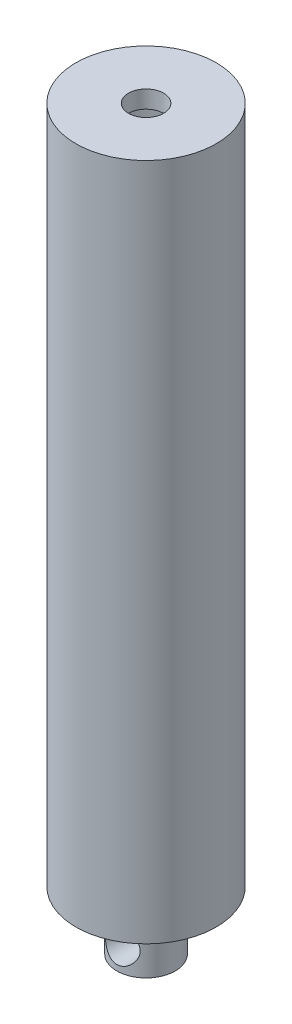
ISO-10303-21;
HEADER;
FILE_DESCRIPTION(('STEP AP214'),'2;1');
FILE_NAME('part.step','',(''),(''),'','','');
FILE_SCHEMA(('AUTOMOTIVE_DESIGN { 1 0 10303 214 1 1 1 1 }'));
ENDSEC;
DATA;
#1=APPLICATION_CONTEXT('core data for automotive mechanical design processes');
#2=APPLICATION_PROTOCOL_DEFINITION('international standard','automotive_design',2000,#1);
#3=PRODUCT_CONTEXT('',#1,'mechanical');
#4=PRODUCT('Part','Part','',(#3));
#5=PRODUCT_RELATED_PRODUCT_CATEGORY('part','',(#4));
#6=PRODUCT_DEFINITION_FORMATION('','',#4);
#7=PRODUCT_DEFINITION_CONTEXT('part definition',#1,'design');
#8=PRODUCT_DEFINITION('design','',#6,#7);
#9=PRODUCT_DEFINITION_SHAPE('','',#8);
#10=(LENGTH_UNIT() NAMED_UNIT(*) SI_UNIT(.MILLI.,.METRE.));
#11=(NAMED_UNIT(*) PLANE_ANGLE_UNIT() SI_UNIT($,.RADIAN.));
#12=(NAMED_UNIT(*) SI_UNIT($,.STERADIAN.) SOLID_ANGLE_UNIT());
#13=UNCERTAINTY_MEASURE_WITH_UNIT(LENGTH_MEASURE(1.E-05),#10,'distance_accuracy_value','');
#14=(GEOMETRIC_REPRESENTATION_CONTEXT(3) GLOBAL_UNCERTAINTY_ASSIGNED_CONTEXT((#13)) GLOBAL_UNIT_ASSIGNED_CONTEXT((#10,
#11,#12)) REPRESENTATION_CONTEXT('',''));
#15=CARTESIAN_POINT('',(0.,0.,0.));
#16=DIRECTION('',(0.,0.,1.));
#17=DIRECTION('',(1.,0.,0.));
#18=AXIS2_PLACEMENT_3D('',#15,#16,#17);
#19=CARTESIAN_POINT('',(0.,0.,0.));
#20=DIRECTION('',(0.,1.,0.));
#21=DIRECTION('',(0.,0.,1.));
#22=AXIS2_PLACEMENT_3D('',#19,#20,#21);
#23=PLANE('',#22);
#24=CARTESIAN_POINT('',(0.,0.,0.));
#25=DIRECTION('',(0.,-1.,0.));
#26=DIRECTION('',(0.,0.,-1.));
#27=AXIS2_PLACEMENT_3D('',#24,#25,#26);
#28=CIRCLE('',#27,5.);
#29=CARTESIAN_POINT('',(0.,0.,-5.));
#30=VERTEX_POINT('',#29);
#31=EDGE_CURVE('E10',#30,#30,#28,.T.);
#32=ORIENTED_EDGE('',*,*,#31,.T.);
#33=EDGE_LOOP('',(#32));
#34=FACE_BOUND('',#33,.T.);
#35=ADVANCED_FACE('F31',(#34),#23,.F.);
#36=CARTESIAN_POINT('',(0.,0.,0.));
#37=DIRECTION('',(0.,-1.,0.));
#38=DIRECTION('',(0.,0.,-1.));
#39=AXIS2_PLACEMENT_3D('',#36,#37,#38);
#40=CYLINDRICAL_SURFACE('',#39,5.);
#41=CARTESIAN_POINT('',(0.,6.96325935626031,-5.));
#42=CARTESIAN_POINT('',(-0.0767697294351706,6.96325830001577,-4.99999907546385));
#43=CARTESIAN_POINT('',(-0.153562134518387,6.96030576269024,-4.99822567812271));
#44=CARTESIAN_POINT('',(-0.306548487758715,6.94854512328057,-4.99118362570631));
#45=CARTESIAN_POINT('',(-0.382742059346593,6.93973359507208,-4.98591292553957));
#46=CARTESIAN_POINT('',(-0.609808130024627,6.90461079679718,-4.96499345352549));
#47=CARTESIAN_POINT('',(-0.758981863291667,6.86961165382687,-4.94423772571335));
#48=CARTESIAN_POINT('',(-1.04754167363585,6.77848661275619,-4.89123238995897));
#49=CARTESIAN_POINT('',(-1.18697226741342,6.72246543424757,-4.8590397955111));
#50=CARTESIAN_POINT('',(-1.45405042800218,6.59153869566327,-4.7859070225578));
#51=CARTESIAN_POINT('',(-1.58170090938261,6.51663782390015,-4.74496901614699));
#52=CARTESIAN_POINT('',(-1.83260160381823,6.34370970114519,-4.65410731283371));
#53=CARTESIAN_POINT('',(-1.95476885986166,6.24435196509377,-4.60373587041895));
#54=CARTESIAN_POINT('',(-2.1817645874806,6.02832494906812,-4.50060875905921));
#55=CARTESIAN_POINT('',(-2.28657046750403,5.91163348204196,-4.4478500955754));
#56=CARTESIAN_POINT('',(-2.48890019509837,5.6474123350914,-4.33822134833335));
#57=CARTESIAN_POINT('',(-2.5839553962784,5.49785581413813,-4.28164035635797));
#58=CARTESIAN_POINT('',(-2.74722868670786,5.18156620993343,-4.17876602596121));
#59=CARTESIAN_POINT('',(-2.8154903315581,5.01486156422715,-4.13245604474886));
#60=CARTESIAN_POINT('',(-2.90881204577224,4.71006645460341,-4.06709259377223));
#61=CARTESIAN_POINT('',(-2.94032394587637,4.57478735789892,-4.04415766338645));
#62=CARTESIAN_POINT('',(-2.98432344587083,4.29965192573892,-4.01180616527621));
#63=CARTESIAN_POINT('',(-2.99683469884359,4.15980150295627,-4.00237279089368));
#64=CARTESIAN_POINT('',(-3.0021101681982,3.87923636361245,-3.99841845126251));
#65=CARTESIAN_POINT('',(-2.99483563630785,3.73852049034844,-4.00392674756739));
#66=CARTESIAN_POINT('',(-2.96092124146105,3.46070182114245,-4.02906522155629));
#67=CARTESIAN_POINT('',(-2.93426681225441,3.32360182331882,-4.04870602134773));
#68=CARTESIAN_POINT('',(-2.86347831933193,3.05819881400977,-4.09906376582929));
#69=CARTESIAN_POINT('',(-2.8195745342289,2.92980503326585,-4.12963433300037));
#70=CARTESIAN_POINT('',(-2.71590167467071,2.68186958962851,-4.19854092703026));
#71=CARTESIAN_POINT('',(-2.65612678414159,2.56233119243128,-4.2368797994146));
#72=CARTESIAN_POINT('',(-2.51035773820671,2.31329021860397,-4.32510698365562));
#73=CARTESIAN_POINT('',(-2.42160671901867,2.18569936389258,-4.3758426358075));
#74=CARTESIAN_POINT('',(-2.22582963207776,1.94591019904019,-4.4786102252415));
#75=CARTESIAN_POINT('',(-2.11878609335504,1.83372679085818,-4.53064336077654));
#76=CARTESIAN_POINT('',(-1.87159040921357,1.61201709681182,-4.63871766962914));
#77=CARTESIAN_POINT('',(-1.72890315178768,1.50503996502296,-4.69430681953073));
#78=CARTESIAN_POINT('',(-1.50061053630278,1.36399064353745,-4.77018325995047));
#79=CARTESIAN_POINT('',(-1.42209821815681,1.3201952207442,-4.79423315237467));
#80=CARTESIAN_POINT('',(-1.26074368673913,1.23954053264931,-4.83916496756429));
#81=CARTESIAN_POINT('',(-1.17790417501176,1.2026770042395,-4.86004883588963));
#82=CARTESIAN_POINT('',(-1.01376371174001,1.13844791340367,-4.8968267274493));
#83=CARTESIAN_POINT('',(-0.932690066663955,1.1106327958111,-4.91295100454953));
#84=CARTESIAN_POINT('',(-0.767879949732825,1.06192540041508,-4.94139126794745));
#85=CARTESIAN_POINT('',(-0.684144997174636,1.04102924781395,-4.95370938553284));
#86=CARTESIAN_POINT('',(-0.514744462654421,1.00648750153555,-4.97416370514887));
#87=CARTESIAN_POINT('',(-0.429080341969608,0.992836600431699,-4.98230296820872));
#88=CARTESIAN_POINT('',(-0.256621746592204,0.972993171870105,-4.99415996414414));
#89=CARTESIAN_POINT('',(-0.169827432617757,0.966799595408988,-4.99787831889699));
#90=CARTESIAN_POINT('',(0.0673242571106443,0.960266685976682,-5.00179157954795));
#91=CARTESIAN_POINT('',(0.218056842610662,0.96744781062971,-4.99746512571837));
#92=CARTESIAN_POINT('',(0.515686907628998,1.00410489798941,-4.97557955020067));
#93=CARTESIAN_POINT('',(0.662584464852967,1.03358040860217,-4.95802069684413));
#94=CARTESIAN_POINT('',(0.945142599254815,1.11234781544458,-4.91189447655688));
#95=CARTESIAN_POINT('',(1.08098954856944,1.16114048285232,-4.88360514429733));
#96=CARTESIAN_POINT('',(1.34253345184752,1.27661368046122,-4.81827798628348));
#97=CARTESIAN_POINT('',(1.46822839746276,1.34329773885438,-4.78123843515362));
#98=CARTESIAN_POINT('',(1.7200119213015,1.50037344723828,-4.69690981059277));
#99=CARTESIAN_POINT('',(1.84478813824221,1.59250705009779,-4.6489560240695));
#100=CARTESIAN_POINT('',(2.07805222548222,1.79404210751507,-4.54948534225871));
#101=CARTESIAN_POINT('',(2.18652085154156,1.90346365586302,-4.49796434043363));
#102=CARTESIAN_POINT('',(2.39863988264158,2.15308014775347,-4.38890846835682));
#103=CARTESIAN_POINT('',(2.49982037884172,2.29542713020335,-4.33146483230154));
#104=CARTESIAN_POINT('',(2.67690479207535,2.59769140238787,-4.22432364395571));
#105=CARTESIAN_POINT('',(2.75283533845462,2.75758994341157,-4.1746179606141));
#106=CARTESIAN_POINT('',(2.86285157351706,3.05574540137103,-4.09969818429266));
#107=CARTESIAN_POINT('',(2.90243250662613,3.19121998090235,-4.07151318633887));
#108=CARTESIAN_POINT('',(2.96227327821697,3.46832351249554,-4.02819211510624));
#109=CARTESIAN_POINT('',(2.98255990395067,3.60994364571183,-4.01303795327895));
#110=CARTESIAN_POINT('',(3.00268261034206,3.89601325065553,-3.99800893189922));
#111=CARTESIAN_POINT('',(3.00244179030845,4.04047133450861,-3.99819152744816));
#112=CARTESIAN_POINT('',(2.98132945103105,4.32704823060671,-4.01395435932838));
#113=CARTESIAN_POINT('',(2.96044671369591,4.46916572813512,-4.02954296823692));
#114=CARTESIAN_POINT('',(2.90080351212233,4.74023618025541,-4.07266369966216));
#115=CARTESIAN_POINT('',(2.86295284328648,4.86949350418467,-4.09958421715569));
#116=CARTESIAN_POINT('',(2.77126473512031,5.11993390591346,-4.16211005816609));
#117=CARTESIAN_POINT('',(2.7174212751772,5.2411139218733,-4.19771865147484));
#118=CARTESIAN_POINT('',(2.58578536859698,5.4918988957203,-4.28025972950371));
#119=CARTESIAN_POINT('',(2.50558518231556,5.61994086447508,-4.32809142579694));
#120=CARTESIAN_POINT('',(2.32751213746957,5.86202020156691,-4.42640286674054));
#121=CARTESIAN_POINT('',(2.22962472612067,5.97604590673986,-4.47688476749088));
#122=CARTESIAN_POINT('',(2.00020353552556,6.20595819958978,-4.5845123827036));
#123=CARTESIAN_POINT('',(1.86578571790514,6.31910923612192,-4.64140045738634));
#124=CARTESIAN_POINT('',(1.57689277813436,6.52146734230845,-4.74731429537958));
#125=CARTESIAN_POINT('',(1.42241049573676,6.61066582918002,-4.79633723789531));
#126=CARTESIAN_POINT('',(1.18102189661685,6.72238383045084,-4.85920558314903));
#127=CARTESIAN_POINT('',(1.10025014285135,6.7555953522248,-4.87817139185349));
#128=CARTESIAN_POINT('',(0.935442217988384,6.81503149440377,-4.91243413775203));
#129=CARTESIAN_POINT('',(0.851407984788098,6.84126019196124,-4.9277332153652));
#130=CARTESIAN_POINT('',(0.681001816074564,6.88626879833606,-4.95415527987996));
#131=CARTESIAN_POINT('',(0.594637500609291,6.90507043356361,-4.9652904423195));
#132=CARTESIAN_POINT('',(0.420183746020761,6.9350037115833,-4.98308318645254));
#133=CARTESIAN_POINT('',(0.332095806784395,6.94614174241362,-4.98974449723791));
#134=CARTESIAN_POINT('',(0.203123929661335,6.95665104006564,-4.99603728421477));
#135=CARTESIAN_POINT('',(0.162556281113486,6.95912778671431,-4.99752198179196));
#136=CARTESIAN_POINT('',(0.0813278781867664,6.96243225317425,-4.99950360169341));
#137=CARTESIAN_POINT('',(0.0406671206271712,6.96325991578324,-5.00000048975323));
#138=CARTESIAN_POINT('',(0.,6.96325935626031,-5.));
#139=B_SPLINE_CURVE_WITH_KNOTS('',3,(#41,#42,#43,#44,#45,#46,#47,#48,#49,#50,#51,#52,#53,#54,
#55,#56,#57,#58,#59,#60,#61,#62,#63,#64,#65,#66,#67,#68,#69,#70,#71,#72,#73,#74,#75,#76,#77,#78,
#79,#80,#81,#82,#83,#84,#85,#86,#87,#88,#89,#90,#91,#92,#93,#94,#95,#96,#97,#98,#99,#100,#101,
#102,#103,#104,#105,#106,#107,#108,#109,#110,#111,#112,#113,#114,#115,#116,#117,#118,#119,#120,
#121,#122,#123,#124,#125,#126,#127,#128,#129,#130,#131,#132,#133,#134,#135,#136,#137,#138),
.UNSPECIFIED.,.T.,.F.,(4,2,2,2,2,2,2,2,2,2,2,2,2,2,2,2,2,2,2,2,2,2,2,2,2,2,2,2,2,2,2,2,2,2,2,2,
2,2,2,2,2,2,2,2,2,2,2,2,4),(0.,0.230263300595003,0.4606613693334,0.922002149276126,
1.38107466343613,1.84003329022065,2.33408870888555,2.82878205293211,3.38413315803225,
3.93857770807794,4.35913349134877,4.77916531256766,5.20002031165062,5.62119195971355,
6.03692224610024,6.45280509043347,6.94139679873935,7.43045779030959,7.98767605192993,
8.26653157143431,8.54521503013734,8.80648473589063,9.06760787545943,9.32853946730961,
9.58943435026958,10.0398406663534,10.490237849174,10.9296843257003,11.3692175250854,
11.8543559282721,12.3400624135416,12.889063860465,13.437484464234,13.8674843581987,
14.2968863865712,14.7278971274535,15.1591422350194,15.5696105785277,15.9802336423656,
16.4539008129506,16.927959499309,17.4794148474152,18.0310675325446,18.2988384573895,
18.5664526907294,18.8332781687618,19.0998809626714,19.221853785686,19.3438308395353),.UNSPECIFIED.);
#140=CARTESIAN_POINT('',(0.,6.96325935626031,-5.));
#141=VERTEX_POINT('',#140);
#142=EDGE_CURVE('E34',#141,#141,#139,.T.);
#143=ORIENTED_EDGE('',*,*,#142,.T.);
#144=EDGE_LOOP('',(#143));
#145=FACE_BOUND('',#144,.T.);
#146=CARTESIAN_POINT('',(3.,3.96325935626031,4.));
#147=CARTESIAN_POINT('',(2.9999999059924,3.88779774589465,3.99999997094658));
#148=CARTESIAN_POINT('',(2.99714660074499,3.8123394044346,4.00214560778386));
#149=CARTESIAN_POINT('',(2.98579602023829,3.66207577710443,4.01061905841259));
#150=CARTESIAN_POINT('',(2.97729658251829,3.58727075257959,4.01694847458097));
#151=CARTESIAN_POINT('',(2.94350195877,3.36471695546019,4.04185988554313));
#152=CARTESIAN_POINT('',(2.90991036792577,3.21879319322166,4.06636523363867));
#153=CARTESIAN_POINT('',(2.82286888064331,2.93706406238728,4.12724466313279));
#154=CARTESIAN_POINT('',(2.76956233581239,2.80119394653875,4.16353284212727));
#155=CARTESIAN_POINT('',(2.64505893939301,2.54039218483435,4.24371857831163));
#156=CARTESIAN_POINT('',(2.57385675138361,2.41546381678215,4.28761840405594));
#157=CARTESIAN_POINT('',(2.40542341931062,2.16335804601495,4.3845721143975));
#158=CARTESIAN_POINT('',(2.30607419983945,2.03777327551457,4.43808896832273));
#159=CARTESIAN_POINT('',(2.08854542159202,1.8037339998914,4.54452303763808));
#160=CARTESIAN_POINT('',(1.97035175093534,1.69529245483706,4.59743977155758));
#161=CARTESIAN_POINT('',(1.70284578042267,1.48697688754607,4.70351798165429));
#162=CARTESIAN_POINT('',(1.55155129309906,1.38929294261925,4.75608869625048));
#163=CARTESIAN_POINT('',(1.31132430439157,1.26351284767234,4.82570563669468));
#164=CARTESIAN_POINT('',(1.22900736782604,1.22503524080219,4.84737661360987));
#165=CARTESIAN_POINT('',(1.06047221299631,1.15546839138116,4.88701002756048));
#166=CARTESIAN_POINT('',(0.974256618946846,1.12437426454874,4.90497491519086));
#167=CARTESIAN_POINT('',(0.806968026671437,1.07263189380702,4.9351119388654));
#168=CARTESIAN_POINT('',(0.726184158740188,1.05127208473121,4.94767216447126));
#169=CARTESIAN_POINT('',(0.562666348744431,1.01530939490935,4.96892323787741));
#170=CARTESIAN_POINT('',(0.479933520527564,1.00070274862271,4.97761624192487));
#171=CARTESIAN_POINT('',(0.313244621267394,0.978474671744215,4.99087754875312));
#172=CARTESIAN_POINT('',(0.229289227265367,0.970849513948509,4.99544805239181));
#173=CARTESIAN_POINT('',(0.0609397888852056,0.96269271641313,5.00033941607428));
#174=CARTESIAN_POINT('',(-0.0234542099897593,0.962160354966749,5.00066070848407));
#175=CARTESIAN_POINT('',(-0.255171183646357,0.970502138540053,4.99565270087357));
#176=CARTESIAN_POINT('',(-0.402219957267169,0.986730505909459,4.98590479614142));
#177=CARTESIAN_POINT('',(-0.690956248818426,1.04021484994273,4.95416390550291));
#178=CARTESIAN_POINT('',(-0.832643369131343,1.07747238287081,4.9321700133334));
#179=CARTESIAN_POINT('',(-1.10810607069191,1.17159158926226,4.87769707511975));
#180=CARTESIAN_POINT('',(-1.2418309672266,1.22856577646023,4.84515792140775));
#181=CARTESIAN_POINT('',(-1.49797933560354,1.360028290712,4.77219304045846));
#182=CARTESIAN_POINT('',(-1.62039986081242,1.43452116639617,4.73176526544935));
#183=CARTESIAN_POINT('',(-1.86614789799246,1.60893763587883,4.64075842839173));
#184=CARTESIAN_POINT('',(-1.98783715480756,1.71083600479581,4.58954363323803));
#185=CARTESIAN_POINT('',(-2.2134294892317,1.93206756636517,4.48511110796774));
#186=CARTESIAN_POINT('',(-2.31730807434112,2.05142435597936,4.4318907405416));
#187=CARTESIAN_POINT('',(-2.51649670159325,2.32056617665806,4.32222149525339));
#188=CARTESIAN_POINT('',(-2.60941864927586,2.47227451158991,4.26611322583746));
#189=CARTESIAN_POINT('',(-2.76794435835452,2.79267181728697,4.16501759300692));
#190=CARTESIAN_POINT('',(-2.83359844351372,2.96132878757455,4.12000980621702));
#191=CARTESIAN_POINT('',(-2.92154993808436,3.26804662075594,4.05791730375361));
#192=CARTESIAN_POINT('',(-2.95055806318484,3.40334062205264,4.03667777278559));
#193=CARTESIAN_POINT('',(-2.98961745817055,3.67800657566157,4.00784301513238));
#194=CARTESIAN_POINT('',(-2.9996907751055,3.81737359314482,4.00023192044755));
#195=CARTESIAN_POINT('',(-3.00029561322377,4.09636272522195,3.9997782882838));
#196=CARTESIAN_POINT('',(-2.99080006076193,4.23598492586203,4.00695621149423));
#197=CARTESIAN_POINT('',(-2.95280584471632,4.51123402857408,4.03503040875294));
#198=CARTESIAN_POINT('',(-2.92429216045109,4.64685768408022,4.05593752603304));
#199=CARTESIAN_POINT('',(-2.84976612867927,4.91068857180979,4.10863539286051));
#200=CARTESIAN_POINT('',(-2.80377564381491,5.03890484039786,4.14041253958232));
#201=CARTESIAN_POINT('',(-2.69592568264801,5.28621457656783,4.21143069058874));
#202=CARTESIAN_POINT('',(-2.63406022035171,5.40530458085421,4.25067450889246));
#203=CARTESIAN_POINT('',(-2.48334675803862,5.65374045150662,4.34073681424694));
#204=CARTESIAN_POINT('',(-2.391645038527,5.78106478858975,4.39236652981539));
#205=CARTESIAN_POINT('',(-2.18975614095891,6.01982656020572,4.49643335252964));
#206=CARTESIAN_POINT('',(-2.07955127457131,6.13124860235475,4.54887118822612));
#207=CARTESIAN_POINT('',(-1.82651475528323,6.34972334757606,4.65671991538655));
#208=CARTESIAN_POINT('',(-1.68130397020029,6.4543240620232,4.71163080343122));
#209=CARTESIAN_POINT('',(-1.44944631278512,6.5914138539837,4.78599458202112));
#210=CARTESIAN_POINT('',(-1.36978605711653,6.63382135839722,4.80945640676867));
#211=CARTESIAN_POINT('',(-1.20623656162325,6.7115632397388,4.85305400686526));
#212=CARTESIAN_POINT('',(-1.12235002598574,6.74690206937901,4.87319187464059));
#213=CARTESIAN_POINT('',(-0.957140698774938,6.80773899949474,4.90820667253681));
#214=CARTESIAN_POINT('',(-0.876069467337986,6.8337630747221,4.9233583127873));
#215=CARTESIAN_POINT('',(-0.711460619981305,6.8789243378694,4.94982497459132));
#216=CARTESIAN_POINT('',(-0.627924414708833,6.89806538514022,4.96114214594589));
#217=CARTESIAN_POINT('',(-0.459119615082281,6.92915966597341,4.9795990393125));
#218=CARTESIAN_POINT('',(-0.373852241304046,6.94111779362087,4.98674160560362));
#219=CARTESIAN_POINT('',(-0.202384159163473,6.95766611791933,4.99664216975594));
#220=CARTESIAN_POINT('',(-0.116183573945418,6.96225727504926,4.99940073918633));
#221=CARTESIAN_POINT('',(0.119519384080581,6.96458764601971,5.00079353601933));
#222=CARTESIAN_POINT('',(0.269213134971587,6.95486043083441,4.9949361975757));
#223=CARTESIAN_POINT('',(0.564325544477557,6.91347730211137,4.97026391444784));
#224=CARTESIAN_POINT('',(0.709744155455481,6.88182114432022,4.95144882543497));
#225=CARTESIAN_POINT('',(0.990283617430277,6.79881878561403,4.90298726022977));
#226=CARTESIAN_POINT('',(1.1255320564868,6.74779591671131,4.87351900635897));
#227=CARTESIAN_POINT('',(1.38556595318152,6.62797841449683,4.8060670798365));
#228=CARTESIAN_POINT('',(1.51034905620296,6.55917979591675,4.76808149787885));
#229=CARTESIAN_POINT('',(1.76052652812015,6.39740944936456,4.68186861678971));
#230=CARTESIAN_POINT('',(1.88451663454097,6.30262429273226,4.63297714592576));
#231=CARTESIAN_POINT('',(2.11579577789689,6.09575093169482,4.5320378935883));
#232=CARTESIAN_POINT('',(2.22306604531463,5.98364355859592,4.47998665474642));
#233=CARTESIAN_POINT('',(2.43181699852643,5.72869831288157,4.37056449731607));
#234=CARTESIAN_POINT('',(2.53083841179814,5.58376627177121,4.31335603990193));
#235=CARTESIAN_POINT('',(2.70314606061125,5.27624978366504,4.20752457767503));
#236=CARTESIAN_POINT('',(2.77644567607669,5.11367457206227,4.15889711577767));
#237=CARTESIAN_POINT('',(2.86193484914579,4.86663680357268,4.10004730463765));
#238=CARTESIAN_POINT('',(2.88571236613332,4.78760076496308,4.0832950867822));
#239=CARTESIAN_POINT('',(2.92679381745552,4.62712891446014,4.05395087655969));
#240=CARTESIAN_POINT('',(2.94410184772356,4.54569465627299,4.04135625254712));
#241=CARTESIAN_POINT('',(2.97191221271433,4.38121280556625,4.0209497222627));
#242=CARTESIAN_POINT('',(2.98242533831514,4.29816798788858,4.01313023377048));
#243=CARTESIAN_POINT('',(2.99646884485439,4.13116713959669,4.00265571377826));
#244=CARTESIAN_POINT('',(3.00000010458449,4.0472112249979,4.00000003232225));
#245=CARTESIAN_POINT('',(3.,3.96325935626031,4.));
#246=B_SPLINE_CURVE_WITH_KNOTS('',3,(#146,#147,#148,#149,#150,#151,#152,#153,#154,#155,#156,
#157,#158,#159,#160,#161,#162,#163,#164,#165,#166,#167,#168,#169,#170,#171,#172,#173,#174,#175,
#176,#177,#178,#179,#180,#181,#182,#183,#184,#185,#186,#187,#188,#189,#190,#191,#192,#193,#194,
#195,#196,#197,#198,#199,#200,#201,#202,#203,#204,#205,#206,#207,#208,#209,#210,#211,#212,#213,
#214,#215,#216,#217,#218,#219,#220,#221,#222,#223,#224,#225,#226,#227,#228,#229,#230,#231,#232,
#233,#234,#235,#236,#237,#238,#239,#240,#241,#242,#243,#244,#245),.UNSPECIFIED.,.T.,.F.,(4,2,2,
2,2,2,2,2,2,2,2,2,2,2,2,2,2,2,2,2,2,2,2,2,2,2,2,2,2,2,2,2,2,2,2,2,2,2,2,2,2,2,2,2,2,2,2,2,2,4),
(0.,0.226288173517879,0.452663065091107,0.905305714765856,1.35471981612576,1.80426809059901,
2.30878181396805,2.81367513819685,3.37309572088444,3.65297634398311,3.93267130287329,
4.18580566749444,4.43879871451846,4.69165661737851,4.94448879122709,5.38694235003539,
5.82942865693065,6.27448283989929,6.71965270654932,7.21799594026829,7.71701907227943,
8.27387316194679,8.82969494223662,9.24786570023494,9.6655492520208,10.0838110593649,
10.5024036052238,10.9204742264512,11.3387027222345,11.8323285087813,12.3264288987103,
12.884776299373,13.1641700331408,13.4433872125907,13.7024631857776,13.9613936663243,
14.2201475237758,14.4788676430947,14.9267946196281,15.3747265854331,15.8154875864153,
16.2563474905318,16.7450674536299,17.2343321574792,17.7856420979722,18.3366648323363,
18.5890061072372,18.8411873492279,19.0929671157917,19.3447151893882),.UNSPECIFIED.);
#247=CARTESIAN_POINT('',(3.,3.96325935626031,4.));
#248=VERTEX_POINT('',#247);
#249=EDGE_CURVE('E49',#248,#248,#246,.T.);
#250=ORIENTED_EDGE('',*,*,#249,.T.);
#251=EDGE_LOOP('',(#250));
#252=FACE_BOUND('',#251,.T.);
#253=ORIENTED_EDGE('',*,*,#31,.F.);
#254=EDGE_LOOP('',(#253));
#255=FACE_BOUND('',#254,.T.);
#256=CARTESIAN_POINT('',(0.,10.,0.));
#257=DIRECTION('',(0.,-1.,0.));
#258=DIRECTION('',(0.,0.,-1.));
#259=AXIS2_PLACEMENT_3D('',#256,#257,#258);
#260=CIRCLE('',#259,5.);
#261=CARTESIAN_POINT('',(0.,10.,-5.));
#262=VERTEX_POINT('',#261);
#263=EDGE_CURVE('E41',#262,#262,#260,.T.);
#264=ORIENTED_EDGE('',*,*,#263,.T.);
#265=EDGE_LOOP('',(#264));
#266=FACE_BOUND('',#265,.T.);
#267=ADVANCED_FACE('F53',(#145,#252,#255,#266),#40,.T.);
#268=CARTESIAN_POINT('',(-5.,10.,0.));
#269=DIRECTION('',(0.,1.,0.));
#270=DIRECTION('',(0.,0.,1.));
#271=AXIS2_PLACEMENT_3D('',#268,#269,#270);
#272=PLANE('',#271);
#273=ORIENTED_EDGE('',*,*,#263,.F.);
#274=EDGE_LOOP('',(#273));
#275=FACE_BOUND('',#274,.T.);
#276=CARTESIAN_POINT('',(0.,10.,0.));
#277=DIRECTION('',(0.,-1.,0.));
#278=DIRECTION('',(0.,0.,-1.));
#279=AXIS2_PLACEMENT_3D('',#276,#277,#278);
#280=CIRCLE('',#279,12.);
#281=CARTESIAN_POINT('',(0.,10.,-12.));
#282=VERTEX_POINT('',#281);
#283=EDGE_CURVE('E46',#282,#282,#280,.T.);
#284=ORIENTED_EDGE('',*,*,#283,.T.);
#285=EDGE_LOOP('',(#284));
#286=FACE_BOUND('',#285,.T.);
#287=ADVANCED_FACE('F84',(#275,#286),#272,.F.);
#288=CARTESIAN_POINT('',(0.,0.,0.));
#289=DIRECTION('',(0.,-1.,0.));
#290=DIRECTION('',(0.,0.,-1.));
#291=AXIS2_PLACEMENT_3D('',#288,#289,#290);
#292=CYLINDRICAL_SURFACE('',#291,12.);
#293=ORIENTED_EDGE('',*,*,#283,.F.);
#294=EDGE_LOOP('',(#293));
#295=FACE_BOUND('',#294,.T.);
#296=CARTESIAN_POINT('',(0.,126.,0.));
#297=DIRECTION('',(0.,-1.,0.));
#298=DIRECTION('',(0.,0.,-1.));
#299=AXIS2_PLACEMENT_3D('',#296,#297,#298);
#300=CIRCLE('',#299,12.);
#301=CARTESIAN_POINT('',(0.,126.,-12.));
#302=VERTEX_POINT('',#301);
#303=EDGE_CURVE('E155',#302,#302,#300,.T.);
#304=ORIENTED_EDGE('',*,*,#303,.T.);
#305=EDGE_LOOP('',(#304));
#306=FACE_BOUND('',#305,.T.);
#307=ADVANCED_FACE('F81',(#295,#306),#292,.T.);
#308=CARTESIAN_POINT('',(-12.,126.,0.));
#309=DIRECTION('',(0.,-1.,0.));
#310=DIRECTION('',(0.,0.,-1.));
#311=AXIS2_PLACEMENT_3D('',#308,#309,#310);
#312=PLANE('',#311);
#313=ORIENTED_EDGE('',*,*,#303,.F.);
#314=EDGE_LOOP('',(#313));
#315=FACE_BOUND('',#314,.T.);
#316=CARTESIAN_POINT('',(0.,126.,0.));
#317=DIRECTION('',(0.,-1.,0.));
#318=DIRECTION('',(0.,0.,-1.));
#319=AXIS2_PLACEMENT_3D('',#316,#317,#318);
#320=CIRCLE('',#319,3.);
#321=CARTESIAN_POINT('',(0.,126.,-3.));
#322=VERTEX_POINT('',#321);
#323=EDGE_CURVE('E157',#322,#322,#320,.T.);
#324=ORIENTED_EDGE('',*,*,#323,.T.);
#325=EDGE_LOOP('',(#324));
#326=FACE_BOUND('',#325,.T.);
#327=ADVANCED_FACE('F77',(#315,#326),#312,.F.);
#328=CARTESIAN_POINT('',(0.,0.,0.));
#329=DIRECTION('',(0.,-1.,0.));
#330=DIRECTION('',(0.,0.,-1.));
#331=AXIS2_PLACEMENT_3D('',#328,#329,#330);
#332=CYLINDRICAL_SURFACE('',#331,3.);
#333=ORIENTED_EDGE('',*,*,#323,.F.);
#334=EDGE_LOOP('',(#333));
#335=FACE_BOUND('',#334,.T.);
#336=CARTESIAN_POINT('',(0.,123.,0.));
#337=DIRECTION('',(0.,-1.,0.));
#338=DIRECTION('',(0.,0.,-1.));
#339=AXIS2_PLACEMENT_3D('',#336,#337,#338);
#340=CIRCLE('',#339,3.);
#341=CARTESIAN_POINT('',(0.,123.,-3.));
#342=VERTEX_POINT('',#341);
#343=EDGE_CURVE('E162',#342,#342,#340,.T.);
#344=ORIENTED_EDGE('',*,*,#343,.T.);
#345=EDGE_LOOP('',(#344));
#346=FACE_BOUND('',#345,.T.);
#347=ADVANCED_FACE('F73',(#335,#346),#332,.F.);
#348=CARTESIAN_POINT('',(-3.,123.,0.));
#349=DIRECTION('',(0.,1.,0.));
#350=DIRECTION('',(0.,0.,1.));
#351=AXIS2_PLACEMENT_3D('',#348,#349,#350);
#352=PLANE('',#351);
#353=ORIENTED_EDGE('',*,*,#343,.F.);
#354=EDGE_LOOP('',(#353));
#355=FACE_BOUND('',#354,.T.);
#356=CARTESIAN_POINT('',(0.,123.,0.));
#357=DIRECTION('',(0.,-1.,0.));
#358=DIRECTION('',(0.,0.,-1.));
#359=AXIS2_PLACEMENT_3D('',#356,#357,#358);
#360=CIRCLE('',#359,10.);
#361=CARTESIAN_POINT('',(0.,123.,-10.));
#362=VERTEX_POINT('',#361);
#363=EDGE_CURVE('E165',#362,#362,#360,.T.);
#364=ORIENTED_EDGE('',*,*,#363,.T.);
#365=EDGE_LOOP('',(#364));
#366=FACE_BOUND('',#365,.T.);
#367=ADVANCED_FACE('F69',(#355,#366),#352,.F.);
#368=CARTESIAN_POINT('',(0.,0.,0.));
#369=DIRECTION('',(0.,-1.,0.));
#370=DIRECTION('',(0.,0.,-1.));
#371=AXIS2_PLACEMENT_3D('',#368,#369,#370);
#372=CYLINDRICAL_SURFACE('',#371,10.);
#373=ORIENTED_EDGE('',*,*,#363,.F.);
#374=EDGE_LOOP('',(#373));
#375=FACE_BOUND('',#374,.T.);
#376=CARTESIAN_POINT('',(0.,13.,0.));
#377=DIRECTION('',(0.,-1.,0.));
#378=DIRECTION('',(0.,0.,-1.));
#379=AXIS2_PLACEMENT_3D('',#376,#377,#378);
#380=CIRCLE('',#379,9.99999999999999);
#381=CARTESIAN_POINT('',(0.,13.,-9.99999999999999));
#382=VERTEX_POINT('',#381);
#383=EDGE_CURVE('E168',#382,#382,#380,.T.);
#384=ORIENTED_EDGE('',*,*,#383,.T.);
#385=EDGE_LOOP('',(#384));
#386=FACE_BOUND('',#385,.T.);
#387=ADVANCED_FACE('F65',(#375,#386),#372,.F.);
#388=CARTESIAN_POINT('',(-9.99999999999999,13.,0.));
#389=DIRECTION('',(0.,-1.,0.));
#390=DIRECTION('',(0.,0.,-1.));
#391=AXIS2_PLACEMENT_3D('',#388,#389,#390);
#392=PLANE('',#391);
#393=ORIENTED_EDGE('',*,*,#383,.F.);
#394=EDGE_LOOP('',(#393));
#395=FACE_BOUND('',#394,.T.);
#396=ADVANCED_FACE('F60',(#395),#392,.F.);
#397=CARTESIAN_POINT('',(0.,3.96325935626031,-12.));
#398=DIRECTION('',(0.,0.,1.));
#399=DIRECTION('',(1.,0.,0.));
#400=AXIS2_PLACEMENT_3D('',#397,#398,#399);
#401=CYLINDRICAL_SURFACE('',#400,3.);
#402=ORIENTED_EDGE('',*,*,#249,.F.);
#403=EDGE_LOOP('',(#402));
#404=FACE_BOUND('',#403,.T.);
#405=ORIENTED_EDGE('',*,*,#142,.F.);
#406=EDGE_LOOP('',(#405));
#407=FACE_BOUND('',#406,.T.);
#408=ADVANCED_FACE('F56',(#404,#407),#401,.F.);
#409=CLOSED_SHELL('',(#35,#267,#287,#307,#327,#347,#367,#387,#396,#408));
#410=MANIFOLD_SOLID_BREP('B2',#409);
#411=ADVANCED_BREP_SHAPE_REPRESENTATION('',(#18,#410),#14);
#412=SHAPE_DEFINITION_REPRESENTATION(#9,#411);
ENDSEC;
END-ISO-10303-21;
